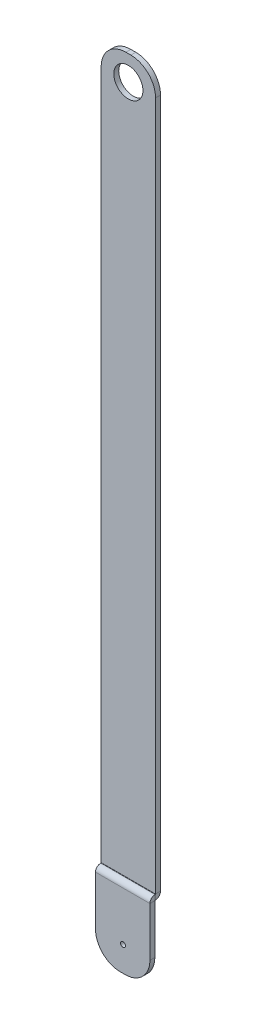
ISO-10303-21;
HEADER;
FILE_DESCRIPTION(('STEP AP214'),'2;1');
FILE_NAME('part.step','',(''),(''),'','','');
FILE_SCHEMA(('AUTOMOTIVE_DESIGN { 1 0 10303 214 1 1 1 1 }'));
ENDSEC;
DATA;
#1=APPLICATION_CONTEXT('core data for automotive mechanical design processes');
#2=APPLICATION_PROTOCOL_DEFINITION('international standard','automotive_design',2000,#1);
#3=PRODUCT_CONTEXT('',#1,'mechanical');
#4=PRODUCT('Part','Part','',(#3));
#5=PRODUCT_RELATED_PRODUCT_CATEGORY('part','',(#4));
#6=PRODUCT_DEFINITION_FORMATION('','',#4);
#7=PRODUCT_DEFINITION_CONTEXT('part definition',#1,'design');
#8=PRODUCT_DEFINITION('design','',#6,#7);
#9=PRODUCT_DEFINITION_SHAPE('','',#8);
#10=(LENGTH_UNIT() NAMED_UNIT(*) SI_UNIT(.MILLI.,.METRE.));
#11=(NAMED_UNIT(*) PLANE_ANGLE_UNIT() SI_UNIT($,.RADIAN.));
#12=(NAMED_UNIT(*) SI_UNIT($,.STERADIAN.) SOLID_ANGLE_UNIT());
#13=UNCERTAINTY_MEASURE_WITH_UNIT(LENGTH_MEASURE(1.E-05),#10,'distance_accuracy_value','');
#14=(GEOMETRIC_REPRESENTATION_CONTEXT(3) GLOBAL_UNCERTAINTY_ASSIGNED_CONTEXT((#13)) GLOBAL_UNIT_ASSIGNED_CONTEXT((#10,
#11,#12)) REPRESENTATION_CONTEXT('',''));
#15=CARTESIAN_POINT('',(0.,0.,0.));
#16=DIRECTION('',(0.,0.,1.));
#17=DIRECTION('',(1.,0.,0.));
#18=AXIS2_PLACEMENT_3D('',#15,#16,#17);
#19=CARTESIAN_POINT('',(-154.99999999991,-143.855000000007,-0.0450000000055647));
#20=DIRECTION('',(-1.,-6.24594126419353E-13,-5.06469866046188E-13));
#21=DIRECTION('',(6.24594126419353E-13,-1.,0.));
#22=AXIS2_PLACEMENT_3D('',#19,#20,#21);
#23=PLANE('',#22);
#24=DIRECTION('',(6.24594126419353E-13,-1.,0.));
#25=VECTOR('',#24,1.);
#26=CARTESIAN_POINT('',(-154.99999999991,-143.855000000007,-0.0450000000055647));
#27=LINE('',#26,#25);
#28=CARTESIAN_POINT('',(-154.99999999991,-143.855000000007,-0.0450000000055647));
#29=VERTEX_POINT('',#28);
#30=CARTESIAN_POINT('',(-154.999999999909,-145.855000000007,-0.0450000000055647));
#31=VERTEX_POINT('',#30);
#32=EDGE_CURVE('E278',#29,#31,#27,.T.);
#33=ORIENTED_EDGE('',*,*,#32,.F.);
#34=CARTESIAN_POINT('',(-154.99999999991,-143.755000000007,-0.0450000000055647));
#35=DIRECTION('',(1.,6.24594126419353E-13,5.06469866046188E-13));
#36=DIRECTION('',(-6.24594126419353E-13,1.,0.));
#37=AXIS2_PLACEMENT_3D('',#34,#35,#36);
#38=CIRCLE('',#37,0.1);
#39=CARTESIAN_POINT('',(-154.99999999991,-143.755000000007,-0.145000000005565));
#40=VERTEX_POINT('',#39);
#41=EDGE_CURVE('E195',#40,#29,#38,.F.);
#42=ORIENTED_EDGE('',*,*,#41,.F.);
#43=DIRECTION('',(-5.06469866046223E-13,0.,1.));
#44=VECTOR('',#43,1.);
#45=CARTESIAN_POINT('',(-154.999999999909,-143.755000000007,-2.14500000000556));
#46=LINE('',#45,#44);
#47=CARTESIAN_POINT('',(-154.999999999909,-143.755000000007,-2.14500000000556));
#48=VERTEX_POINT('',#47);
#49=EDGE_CURVE('E275',#48,#40,#46,.T.);
#50=ORIENTED_EDGE('',*,*,#49,.F.);
#51=CARTESIAN_POINT('',(-154.99999999991,-143.755000000007,-0.0450000000055647));
#52=DIRECTION('',(-1.,-6.24594126419353E-13,-5.06469866046188E-13));
#53=DIRECTION('',(6.24594126419353E-13,-1.,0.));
#54=AXIS2_PLACEMENT_3D('',#51,#52,#53);
#55=CIRCLE('',#54,2.1);
#56=EDGE_CURVE('E205',#48,#31,#55,.T.);
#57=ORIENTED_EDGE('',*,*,#56,.T.);
#58=EDGE_LOOP('',(#33,#42,#50,#57));
#59=FACE_BOUND('',#58,.T.);
#60=ADVANCED_FACE('F40',(#59),#23,.T.);
#61=CARTESIAN_POINT('',(-154.999999999909,-143.755000000007,-2.14500000000556));
#62=DIRECTION('',(-1.,-6.24594126419353E-13,-5.06469866046188E-13));
#63=DIRECTION('',(6.24594126419353E-13,-1.,0.));
#64=AXIS2_PLACEMENT_3D('',#61,#62,#63);
#65=PLANE('',#64);
#66=DIRECTION('',(-5.06469866046189E-13,0.,1.));
#67=VECTOR('',#66,1.);
#68=CARTESIAN_POINT('',(-154.99999999991,-143.855000000007,-0.145000000005565));
#69=LINE('',#68,#67);
#70=CARTESIAN_POINT('',(-154.99999999991,-143.855000000007,0.0449999999944219));
#71=VERTEX_POINT('',#70);
#72=EDGE_CURVE('E193',#29,#71,#69,.T.);
#73=ORIENTED_EDGE('',*,*,#72,.F.);
#74=ORIENTED_EDGE('',*,*,#32,.T.);
#75=DIRECTION('',(-5.06469866046189E-13,0.,1.));
#76=VECTOR('',#75,1.);
#77=CARTESIAN_POINT('',(-154.999999999909,-145.855000000007,-0.145000000005565));
#78=LINE('',#77,#76);
#79=CARTESIAN_POINT('',(-154.999999999909,-145.855000000007,0.0449999999944219));
#80=VERTEX_POINT('',#79);
#81=EDGE_CURVE('E208',#31,#80,#78,.T.);
#82=ORIENTED_EDGE('',*,*,#81,.T.);
#83=DIRECTION('',(-6.24594126419353E-13,1.,0.));
#84=VECTOR('',#83,1.);
#85=CARTESIAN_POINT('',(-154.999999999909,-145.855000000007,0.0449999999944219));
#86=LINE('',#85,#84);
#87=EDGE_CURVE('E167',#80,#71,#86,.T.);
#88=ORIENTED_EDGE('',*,*,#87,.T.);
#89=EDGE_LOOP('',(#73,#74,#82,#88));
#90=FACE_BOUND('',#89,.T.);
#91=ADVANCED_FACE('F344',(#90),#65,.T.);
#92=CARTESIAN_POINT('',(-132.99999999991,-143.754999999993,-0.144999999994422));
#93=DIRECTION('',(1.,6.24594126419353E-13,5.06469866046188E-13));
#94=DIRECTION('',(-6.24594126419353E-13,1.,0.));
#95=AXIS2_PLACEMENT_3D('',#92,#93,#94);
#96=PLANE('',#95);
#97=DIRECTION('',(5.06469866046223E-13,0.,-1.));
#98=VECTOR('',#97,1.);
#99=CARTESIAN_POINT('',(-132.99999999991,-143.754999999993,-0.144999999994422));
#100=LINE('',#99,#98);
#101=CARTESIAN_POINT('',(-132.99999999991,-143.754999999993,-0.144999999994422));
#102=VERTEX_POINT('',#101);
#103=CARTESIAN_POINT('',(-132.999999999909,-143.754999999994,-2.14499999999442));
#104=VERTEX_POINT('',#103);
#105=EDGE_CURVE('E272',#102,#104,#100,.T.);
#106=ORIENTED_EDGE('',*,*,#105,.F.);
#107=CARTESIAN_POINT('',(-132.99999999991,-143.754999999993,-0.0449999999944223));
#108=DIRECTION('',(1.,6.24594126419353E-13,5.06469866046188E-13));
#109=DIRECTION('',(-6.24594126419353E-13,1.,0.));
#110=AXIS2_PLACEMENT_3D('',#107,#108,#109);
#111=CIRCLE('',#110,0.1);
#112=CARTESIAN_POINT('',(-132.99999999991,-143.854999999993,-0.0449999999944223));
#113=VERTEX_POINT('',#112);
#114=EDGE_CURVE('E223',#102,#113,#111,.F.);
#115=ORIENTED_EDGE('',*,*,#114,.T.);
#116=DIRECTION('',(-6.24594126419353E-13,1.,0.));
#117=VECTOR('',#116,1.);
#118=CARTESIAN_POINT('',(-132.999999999909,-145.854999999993,-0.0449999999944223));
#119=LINE('',#118,#117);
#120=CARTESIAN_POINT('',(-132.999999999909,-145.854999999993,-0.0449999999944223));
#121=VERTEX_POINT('',#120);
#122=EDGE_CURVE('E166',#121,#113,#119,.T.);
#123=ORIENTED_EDGE('',*,*,#122,.F.);
#124=CARTESIAN_POINT('',(-132.99999999991,-143.754999999993,-0.0449999999944223));
#125=DIRECTION('',(-1.,-6.24594126419353E-13,-5.06469866046188E-13));
#126=DIRECTION('',(6.24594126419353E-13,-1.,0.));
#127=AXIS2_PLACEMENT_3D('',#124,#125,#126);
#128=CIRCLE('',#127,2.1);
#129=EDGE_CURVE('E230',#104,#121,#128,.T.);
#130=ORIENTED_EDGE('',*,*,#129,.F.);
#131=EDGE_LOOP('',(#106,#115,#123,#130));
#132=FACE_BOUND('',#131,.T.);
#133=ADVANCED_FACE('F388',(#132),#96,.T.);
#134=CARTESIAN_POINT('',(-132.999999999909,-145.854999999993,-0.0449999999944223));
#135=DIRECTION('',(1.,6.24594126419353E-13,5.06469866046188E-13));
#136=DIRECTION('',(-6.24594126419353E-13,1.,0.));
#137=AXIS2_PLACEMENT_3D('',#134,#135,#136);
#138=PLANE('',#137);
#139=DIRECTION('',(6.24594126419353E-13,-1.,0.));
#140=VECTOR('',#139,1.);
#141=CARTESIAN_POINT('',(-133.000000000089,145.145000000007,-2.14499999999442));
#142=LINE('',#141,#140);
#143=CARTESIAN_POINT('',(-133.000000000083,135.145000000007,-2.14499999999442));
#144=VERTEX_POINT('',#143);
#145=EDGE_CURVE('E228',#144,#104,#142,.T.);
#146=ORIENTED_EDGE('',*,*,#145,.F.);
#147=DIRECTION('',(-5.06469866046189E-13,0.,1.));
#148=VECTOR('',#147,1.);
#149=CARTESIAN_POINT('',(-133.000000000084,135.145000000007,-0.0449999999944223));
#150=LINE('',#149,#148);
#151=CARTESIAN_POINT('',(-133.000000000084,135.145000000007,-0.144999999994422));
#152=VERTEX_POINT('',#151);
#153=EDGE_CURVE('E297',#144,#152,#150,.T.);
#154=ORIENTED_EDGE('',*,*,#153,.T.);
#155=DIRECTION('',(6.24594126419353E-13,-1.,0.));
#156=VECTOR('',#155,1.);
#157=CARTESIAN_POINT('',(-133.00000000009,145.145000000007,-0.144999999994422));
#158=LINE('',#157,#156);
#159=EDGE_CURVE('E226',#152,#102,#158,.T.);
#160=ORIENTED_EDGE('',*,*,#159,.T.);
#161=ORIENTED_EDGE('',*,*,#105,.T.);
#162=EDGE_LOOP('',(#146,#154,#160,#161));
#163=FACE_BOUND('',#162,.T.);
#164=ADVANCED_FACE('F317',(#163),#138,.T.);
#165=CARTESIAN_POINT('',(-154.99999999991,-145.955000000007,2.14499999999442));
#166=DIRECTION('',(-1.,-6.24594126419353E-13,-5.06469866046188E-13));
#167=DIRECTION('',(6.24594126419353E-13,-1.,0.));
#168=AXIS2_PLACEMENT_3D('',#165,#166,#167);
#169=PLANE('',#168);
#170=DIRECTION('',(5.06469866046189E-13,0.,-1.));
#171=VECTOR('',#170,1.);
#172=CARTESIAN_POINT('',(-154.99999999991,-145.955000000007,2.14499999999442));
#173=LINE('',#172,#171);
#174=CARTESIAN_POINT('',(-154.99999999991,-145.955000000007,2.14499999999442));
#175=VERTEX_POINT('',#174);
#176=CARTESIAN_POINT('',(-154.999999999909,-145.955000000007,0.144999999994422));
#177=VERTEX_POINT('',#176);
#178=EDGE_CURVE('E154',#175,#177,#173,.T.);
#179=ORIENTED_EDGE('',*,*,#178,.F.);
#180=CARTESIAN_POINT('',(-154.999999999909,-145.955000000007,0.0449999999944219));
#181=DIRECTION('',(-1.,-6.24594126419353E-13,-5.06469866046188E-13));
#182=DIRECTION('',(6.24594126419353E-13,-1.,0.));
#183=AXIS2_PLACEMENT_3D('',#180,#181,#182);
#184=CIRCLE('',#183,2.1);
#185=EDGE_CURVE('E158',#71,#175,#184,.F.);
#186=ORIENTED_EDGE('',*,*,#185,.F.);
#187=ORIENTED_EDGE('',*,*,#87,.F.);
#188=CARTESIAN_POINT('',(-154.999999999909,-145.955000000007,0.0449999999944219));
#189=DIRECTION('',(-1.,-6.24594126419353E-13,-5.06469866046188E-13));
#190=DIRECTION('',(6.24594126419353E-13,-1.,0.));
#191=AXIS2_PLACEMENT_3D('',#188,#189,#190);
#192=CIRCLE('',#191,0.0999999999999998);
#193=EDGE_CURVE('E161',#80,#177,#192,.F.);
#194=ORIENTED_EDGE('',*,*,#193,.T.);
#195=EDGE_LOOP('',(#179,#186,#187,#194));
#196=FACE_BOUND('',#195,.T.);
#197=ADVANCED_FACE('F156',(#196),#169,.T.);
#198=CARTESIAN_POINT('',(-154.999999999909,-145.855000000007,0.0449999999944219));
#199=DIRECTION('',(-1.,-6.24594126419353E-13,-5.06469866046188E-13));
#200=DIRECTION('',(6.24594126419353E-13,-1.,0.));
#201=AXIS2_PLACEMENT_3D('',#198,#199,#200);
#202=PLANE('',#201);
#203=DIRECTION('',(6.24594126419353E-13,-1.,0.));
#204=VECTOR('',#203,1.);
#205=CARTESIAN_POINT('',(-154.99999999991,-143.855000000007,0.144999999994422));
#206=LINE('',#205,#204);
#207=CARTESIAN_POINT('',(-154.999999999896,-165.855000000007,0.144999999994422));
#208=VERTEX_POINT('',#207);
#209=EDGE_CURVE('E188',#177,#208,#206,.T.);
#210=ORIENTED_EDGE('',*,*,#209,.T.);
#211=DIRECTION('',(5.06469866046189E-13,0.,-1.));
#212=VECTOR('',#211,1.);
#213=CARTESIAN_POINT('',(-154.999999999896,-165.855000000007,0.0449999999944219));
#214=LINE('',#213,#212);
#215=CARTESIAN_POINT('',(-154.999999999897,-165.855000000007,2.14499999999442));
#216=VERTEX_POINT('',#215);
#217=EDGE_CURVE('E187',#208,#216,#214,.F.);
#218=ORIENTED_EDGE('',*,*,#217,.T.);
#219=DIRECTION('',(6.24594126419353E-13,-1.,0.));
#220=VECTOR('',#219,1.);
#221=CARTESIAN_POINT('',(-154.999999999911,-143.855000000007,2.14499999999442));
#222=LINE('',#221,#220);
#223=EDGE_CURVE('E175',#175,#216,#222,.T.);
#224=ORIENTED_EDGE('',*,*,#223,.F.);
#225=ORIENTED_EDGE('',*,*,#178,.T.);
#226=EDGE_LOOP('',(#210,#218,#224,#225));
#227=FACE_BOUND('',#226,.T.);
#228=ADVANCED_FACE('F185',(#227),#202,.T.);
#229=CARTESIAN_POINT('',(-132.99999999991,-143.854999999993,0.0450000000055643));
#230=DIRECTION('',(1.,6.24594126419353E-13,5.06469866046188E-13));
#231=DIRECTION('',(-6.24594126419353E-13,1.,0.));
#232=AXIS2_PLACEMENT_3D('',#229,#230,#231);
#233=PLANE('',#232);
#234=DIRECTION('',(6.24594126419353E-13,-1.,0.));
#235=VECTOR('',#234,1.);
#236=CARTESIAN_POINT('',(-132.99999999991,-143.854999999993,0.0450000000055643));
#237=LINE('',#236,#235);
#238=CARTESIAN_POINT('',(-132.99999999991,-143.854999999993,0.0450000000055643));
#239=VERTEX_POINT('',#238);
#240=CARTESIAN_POINT('',(-132.999999999909,-145.854999999993,0.0450000000055643));
#241=VERTEX_POINT('',#240);
#242=EDGE_CURVE('E268',#239,#241,#237,.T.);
#243=ORIENTED_EDGE('',*,*,#242,.F.);
#244=CARTESIAN_POINT('',(-132.999999999909,-145.954999999993,0.0450000000055643));
#245=DIRECTION('',(-1.,-6.24594126419353E-13,-5.06469866046188E-13));
#246=DIRECTION('',(6.24594126419353E-13,-1.,0.));
#247=AXIS2_PLACEMENT_3D('',#244,#245,#246);
#248=CIRCLE('',#247,2.1);
#249=CARTESIAN_POINT('',(-132.99999999991,-145.954999999993,2.14500000000556));
#250=VERTEX_POINT('',#249);
#251=EDGE_CURVE('E218',#239,#250,#248,.F.);
#252=ORIENTED_EDGE('',*,*,#251,.T.);
#253=DIRECTION('',(-5.06469866046189E-13,0.,1.));
#254=VECTOR('',#253,1.);
#255=CARTESIAN_POINT('',(-132.999999999909,-145.954999999993,0.145000000005564));
#256=LINE('',#255,#254);
#257=CARTESIAN_POINT('',(-132.999999999909,-145.954999999993,0.145000000005564));
#258=VERTEX_POINT('',#257);
#259=EDGE_CURVE('E266',#258,#250,#256,.T.);
#260=ORIENTED_EDGE('',*,*,#259,.F.);
#261=CARTESIAN_POINT('',(-132.999999999909,-145.954999999993,0.0450000000055643));
#262=DIRECTION('',(-1.,-6.24594126419353E-13,-5.06469866046188E-13));
#263=DIRECTION('',(6.24594126419353E-13,-1.,0.));
#264=AXIS2_PLACEMENT_3D('',#261,#262,#263);
#265=CIRCLE('',#264,0.0999999999999998);
#266=EDGE_CURVE('E236',#241,#258,#265,.F.);
#267=ORIENTED_EDGE('',*,*,#266,.F.);
#268=EDGE_LOOP('',(#243,#252,#260,#267));
#269=FACE_BOUND('',#268,.T.);
#270=ADVANCED_FACE('F573',(#269),#233,.T.);
#271=CARTESIAN_POINT('',(-132.999999999909,-145.954999999993,0.145000000005564));
#272=DIRECTION('',(1.,6.24594126419353E-13,5.06469866046188E-13));
#273=DIRECTION('',(-6.24594126419353E-13,1.,0.));
#274=AXIS2_PLACEMENT_3D('',#271,#272,#273);
#275=PLANE('',#274);
#276=DIRECTION('',(-5.06469866046189E-13,0.,1.));
#277=VECTOR('',#276,1.);
#278=CARTESIAN_POINT('',(-132.99999999991,-143.854999999993,-0.144999999994422));
#279=LINE('',#278,#277);
#280=EDGE_CURVE('E220',#113,#239,#279,.T.);
#281=ORIENTED_EDGE('',*,*,#280,.T.);
#282=ORIENTED_EDGE('',*,*,#242,.T.);
#283=DIRECTION('',(-5.06469866046189E-13,0.,1.));
#284=VECTOR('',#283,1.);
#285=CARTESIAN_POINT('',(-132.999999999909,-145.854999999993,-0.144999999994422));
#286=LINE('',#285,#284);
#287=EDGE_CURVE('E233',#121,#241,#286,.T.);
#288=ORIENTED_EDGE('',*,*,#287,.F.);
#289=ORIENTED_EDGE('',*,*,#122,.T.);
#290=EDGE_LOOP('',(#281,#282,#288,#289));
#291=FACE_BOUND('',#290,.T.);
#292=ADVANCED_FACE('F447',(#291),#275,.T.);
#293=CARTESIAN_POINT('',(-154.99999999991,-143.855000000007,0.144999999994422));
#294=DIRECTION('',(-5.06469866046189E-13,0.,1.));
#295=DIRECTION('',(-1.,-6.24594126419353E-13,-5.06469866046188E-13));
#296=AXIS2_PLACEMENT_3D('',#293,#294,#295);
#297=PLANE('',#296);
#298=CARTESIAN_POINT('',(-143.883433504186,-165.73802674259,0.145000000000052));
#299=DIRECTION('',(-5.06469866046189E-13,0.,1.));
#300=DIRECTION('',(-1.,-6.24594126419353E-13,-5.06469866046188E-13));
#301=AXIS2_PLACEMENT_3D('',#298,#299,#300);
#302=CIRCLE('',#301,1.);
#303=CARTESIAN_POINT('',(-144.883433504186,-165.73802674259,0.144999999999545));
#304=VERTEX_POINT('',#303);
#305=EDGE_CURVE('E216',#304,#304,#302,.T.);
#306=ORIENTED_EDGE('',*,*,#305,.T.);
#307=EDGE_LOOP('',(#306));
#308=FACE_BOUND('',#307,.T.);
#309=DIRECTION('',(1.,6.24594126419353E-13,5.06469866046188E-13));
#310=VECTOR('',#309,1.);
#311=CARTESIAN_POINT('',(-154.99999999989,-175.855000000007,0.144999999994422));
#312=LINE('',#311,#310);
#313=CARTESIAN_POINT('',(-144.99999999989,-175.855000000001,0.144999999999486));
#314=VERTEX_POINT('',#313);
#315=CARTESIAN_POINT('',(-142.99999999989,-175.855,0.145000000000499));
#316=VERTEX_POINT('',#315);
#317=EDGE_CURVE('E263',#314,#316,#312,.T.);
#318=ORIENTED_EDGE('',*,*,#317,.F.);
#319=CARTESIAN_POINT('',(-144.999999999896,-165.855000000001,0.144999999999486));
#320=DIRECTION('',(-5.06469866046189E-13,0.,1.));
#321=DIRECTION('',(-1.,-6.24594126419353E-13,-5.06469866046188E-13));
#322=AXIS2_PLACEMENT_3D('',#319,#320,#321);
#323=CIRCLE('',#322,10.);
#324=EDGE_CURVE('E287',#314,#208,#323,.F.);
#325=ORIENTED_EDGE('',*,*,#324,.T.);
#326=ORIENTED_EDGE('',*,*,#209,.F.);
#327=DIRECTION('',(1.,6.24594126419353E-13,5.06469866046188E-13));
#328=VECTOR('',#327,1.);
#329=CARTESIAN_POINT('',(-154.999999999909,-145.955000000007,0.144999999994422));
#330=LINE('',#329,#328);
#331=EDGE_CURVE('E212',#177,#258,#330,.T.);
#332=ORIENTED_EDGE('',*,*,#331,.T.);
#333=DIRECTION('',(6.24594126419353E-13,-1.,0.));
#334=VECTOR('',#333,1.);
#335=CARTESIAN_POINT('',(-132.99999999991,-143.854999999993,0.145000000005564));
#336=LINE('',#335,#334);
#337=CARTESIAN_POINT('',(-132.999999999896,-165.854999999993,0.145000000005564));
#338=VERTEX_POINT('',#337);
#339=EDGE_CURVE('E213',#258,#338,#336,.T.);
#340=ORIENTED_EDGE('',*,*,#339,.T.);
#341=CARTESIAN_POINT('',(-142.999999999896,-165.855,0.145000000000499));
#342=DIRECTION('',(-5.06469866046189E-13,0.,1.));
#343=DIRECTION('',(-1.,-6.24594126419353E-13,-5.06469866046188E-13));
#344=AXIS2_PLACEMENT_3D('',#341,#342,#343);
#345=CIRCLE('',#344,10.);
#346=EDGE_CURVE('E285',#338,#316,#345,.F.);
#347=ORIENTED_EDGE('',*,*,#346,.T.);
#348=EDGE_LOOP('',(#318,#325,#326,#332,#340,#347));
#349=FACE_BOUND('',#348,.T.);
#350=ADVANCED_FACE('F357',(#308,#349),#297,.F.);
#351=CARTESIAN_POINT('',(-154.999999999891,-175.855000000007,2.14499999999442));
#352=DIRECTION('',(6.24594126419353E-13,-1.,0.));
#353=DIRECTION('',(1.,6.24594126419353E-13,5.06469866046188E-13));
#354=AXIS2_PLACEMENT_3D('',#351,#352,#353);
#355=PLANE('',#354);
#356=DIRECTION('',(1.,6.24594126419353E-13,5.06469866046188E-13));
#357=VECTOR('',#356,1.);
#358=CARTESIAN_POINT('',(-154.999999999891,-175.855000000007,2.14499999999442));
#359=LINE('',#358,#357);
#360=CARTESIAN_POINT('',(-144.999999999891,-175.855000000001,2.14499999999949));
#361=VERTEX_POINT('',#360);
#362=CARTESIAN_POINT('',(-142.999999999891,-175.855,2.1450000000005));
#363=VERTEX_POINT('',#362);
#364=EDGE_CURVE('E182',#361,#363,#359,.T.);
#365=ORIENTED_EDGE('',*,*,#364,.F.);
#366=DIRECTION('',(5.06469866046189E-13,0.,-1.));
#367=VECTOR('',#366,1.);
#368=CARTESIAN_POINT('',(-144.999999999891,-175.855000000001,2.14499999999949));
#369=LINE('',#368,#367);
#370=EDGE_CURVE('E282',#361,#314,#369,.T.);
#371=ORIENTED_EDGE('',*,*,#370,.T.);
#372=ORIENTED_EDGE('',*,*,#317,.T.);
#373=DIRECTION('',(5.06469866046189E-13,0.,-1.));
#374=VECTOR('',#373,1.);
#375=CARTESIAN_POINT('',(-142.999999999891,-175.855,2.1450000000005));
#376=LINE('',#375,#374);
#377=EDGE_CURVE('E280',#316,#363,#376,.F.);
#378=ORIENTED_EDGE('',*,*,#377,.T.);
#379=EDGE_LOOP('',(#365,#371,#372,#378));
#380=FACE_BOUND('',#379,.T.);
#381=ADVANCED_FACE('F446',(#380),#355,.T.);
#382=CARTESIAN_POINT('',(-154.999999999911,-143.855000000007,2.14499999999442));
#383=DIRECTION('',(-5.06469866046189E-13,0.,1.));
#384=DIRECTION('',(-1.,-6.24594126419353E-13,-5.06469866046188E-13));
#385=AXIS2_PLACEMENT_3D('',#382,#383,#384);
#386=PLANE('',#385);
#387=CARTESIAN_POINT('',(-143.883433504187,-165.73802674259,2.14500000000005));
#388=DIRECTION('',(-5.06469866046189E-13,0.,1.));
#389=DIRECTION('',(-1.,-6.24594126419353E-13,-5.06469866046188E-13));
#390=AXIS2_PLACEMENT_3D('',#387,#388,#389);
#391=CIRCLE('',#390,1.);
#392=CARTESIAN_POINT('',(-144.883433504187,-165.73802674259,2.14499999999955));
#393=VERTEX_POINT('',#392);
#394=EDGE_CURVE('E365',#393,#393,#391,.T.);
#395=ORIENTED_EDGE('',*,*,#394,.F.);
#396=EDGE_LOOP('',(#395));
#397=FACE_BOUND('',#396,.T.);
#398=ORIENTED_EDGE('',*,*,#223,.T.);
#399=CARTESIAN_POINT('',(-144.999999999897,-165.855000000001,2.14499999999949));
#400=DIRECTION('',(-5.06469866046189E-13,0.,1.));
#401=DIRECTION('',(-1.,-6.24594126419353E-13,-5.06469866046188E-13));
#402=AXIS2_PLACEMENT_3D('',#399,#400,#401);
#403=CIRCLE('',#402,10.);
#404=EDGE_CURVE('E292',#216,#361,#403,.T.);
#405=ORIENTED_EDGE('',*,*,#404,.T.);
#406=ORIENTED_EDGE('',*,*,#364,.T.);
#407=CARTESIAN_POINT('',(-142.999999999897,-165.855,2.1450000000005));
#408=DIRECTION('',(-5.06469866046189E-13,0.,1.));
#409=DIRECTION('',(-1.,-6.24594126419353E-13,-5.06469866046188E-13));
#410=AXIS2_PLACEMENT_3D('',#407,#408,#409);
#411=CIRCLE('',#410,10.);
#412=CARTESIAN_POINT('',(-132.999999999897,-165.854999999993,2.14500000000556));
#413=VERTEX_POINT('',#412);
#414=EDGE_CURVE('E290',#363,#413,#411,.T.);
#415=ORIENTED_EDGE('',*,*,#414,.T.);
#416=DIRECTION('',(6.24594126419353E-13,-1.,0.));
#417=VECTOR('',#416,1.);
#418=CARTESIAN_POINT('',(-132.999999999911,-143.854999999993,2.14500000000556));
#419=LINE('',#418,#417);
#420=EDGE_CURVE('E178',#250,#413,#419,.T.);
#421=ORIENTED_EDGE('',*,*,#420,.F.);
#422=DIRECTION('',(1.,6.24594126419353E-13,5.06469866046188E-13));
#423=VECTOR('',#422,1.);
#424=CARTESIAN_POINT('',(-154.99999999991,-145.955000000007,2.14499999999442));
#425=LINE('',#424,#423);
#426=EDGE_CURVE('E173',#175,#250,#425,.T.);
#427=ORIENTED_EDGE('',*,*,#426,.F.);
#428=EDGE_LOOP('',(#398,#405,#406,#415,#421,#427));
#429=FACE_BOUND('',#428,.T.);
#430=ADVANCED_FACE('F174',(#397,#429),#386,.T.);
#431=CARTESIAN_POINT('',(-154.999999999909,-145.955000000007,0.0449999999944219));
#432=DIRECTION('',(1.,6.24594126419353E-13,5.06469866046188E-13));
#433=DIRECTION('',(-6.24594126419353E-13,1.,0.));
#434=AXIS2_PLACEMENT_3D('',#431,#432,#433);
#435=CYLINDRICAL_SURFACE('',#434,2.1);
#436=ORIENTED_EDGE('',*,*,#251,.F.);
#437=DIRECTION('',(1.,6.24594126419353E-13,5.06469866046188E-13));
#438=VECTOR('',#437,1.);
#439=CARTESIAN_POINT('',(-154.99999999991,-143.855000000007,0.0449999999944219));
#440=LINE('',#439,#438);
#441=EDGE_CURVE('E183',#71,#239,#440,.T.);
#442=ORIENTED_EDGE('',*,*,#441,.F.);
#443=ORIENTED_EDGE('',*,*,#185,.T.);
#444=ORIENTED_EDGE('',*,*,#426,.T.);
#445=EDGE_LOOP('',(#436,#442,#443,#444));
#446=FACE_BOUND('',#445,.T.);
#447=ADVANCED_FACE('F191',(#446),#435,.T.);
#448=CARTESIAN_POINT('',(-154.99999999991,-143.855000000007,-0.145000000005565));
#449=DIRECTION('',(-6.24594126419353E-13,1.,0.));
#450=DIRECTION('',(-1.,-6.24594126419353E-13,-5.06469866046188E-13));
#451=AXIS2_PLACEMENT_3D('',#448,#449,#450);
#452=PLANE('',#451);
#453=ORIENTED_EDGE('',*,*,#280,.F.);
#454=DIRECTION('',(1.,6.24594126419353E-13,5.06469866046188E-13));
#455=VECTOR('',#454,1.);
#456=CARTESIAN_POINT('',(-154.99999999991,-143.855000000007,-0.0450000000055647));
#457=LINE('',#456,#455);
#458=EDGE_CURVE('E257',#29,#113,#457,.T.);
#459=ORIENTED_EDGE('',*,*,#458,.F.);
#460=ORIENTED_EDGE('',*,*,#72,.T.);
#461=ORIENTED_EDGE('',*,*,#441,.T.);
#462=EDGE_LOOP('',(#453,#459,#460,#461));
#463=FACE_BOUND('',#462,.T.);
#464=ADVANCED_FACE('F343',(#463),#452,.T.);
#465=CARTESIAN_POINT('',(-154.99999999991,-143.755000000007,-0.0450000000055647));
#466=DIRECTION('',(1.,6.24594126419353E-13,5.06469866046188E-13));
#467=DIRECTION('',(-6.24594126419353E-13,1.,0.));
#468=AXIS2_PLACEMENT_3D('',#465,#466,#467);
#469=CYLINDRICAL_SURFACE('',#468,0.1);
#470=ORIENTED_EDGE('',*,*,#114,.F.);
#471=DIRECTION('',(1.,6.24594126419353E-13,5.06469866046188E-13));
#472=VECTOR('',#471,1.);
#473=CARTESIAN_POINT('',(-154.99999999991,-143.755000000007,-0.145000000005565));
#474=LINE('',#473,#472);
#475=EDGE_CURVE('E254',#40,#102,#474,.T.);
#476=ORIENTED_EDGE('',*,*,#475,.F.);
#477=ORIENTED_EDGE('',*,*,#41,.T.);
#478=ORIENTED_EDGE('',*,*,#458,.T.);
#479=EDGE_LOOP('',(#470,#476,#477,#478));
#480=FACE_BOUND('',#479,.T.);
#481=ADVANCED_FACE('F335',(#480),#469,.F.);
#482=CARTESIAN_POINT('',(-155.00000000009,145.144999999993,-0.145000000005565));
#483=DIRECTION('',(-5.06469866046189E-13,0.,1.));
#484=DIRECTION('',(-1.,-6.24594126419353E-13,-5.06469866046188E-13));
#485=AXIS2_PLACEMENT_3D('',#482,#483,#484);
#486=PLANE('',#485);
#487=CARTESIAN_POINT('',(-144.000000000084,135.145,-0.144999999999994));
#488=DIRECTION('',(-5.06469866046189E-13,0.,1.));
#489=DIRECTION('',(-1.,-6.24594126419353E-13,-5.06469866046188E-13));
#490=AXIS2_PLACEMENT_3D('',#487,#488,#489);
#491=CIRCLE('',#490,5.89418421464922);
#492=CARTESIAN_POINT('',(-149.894184214733,135.144999999996,-0.145000000002979));
#493=VERTEX_POINT('',#492);
#494=EDGE_CURVE('E361',#493,#493,#491,.T.);
#495=ORIENTED_EDGE('',*,*,#494,.F.);
#496=EDGE_LOOP('',(#495));
#497=FACE_BOUND('',#496,.T.);
#498=ORIENTED_EDGE('',*,*,#159,.F.);
#499=CARTESIAN_POINT('',(-143.000000000084,135.145,-0.144999999999487));
#500=DIRECTION('',(-5.06469866046189E-13,0.,1.));
#501=DIRECTION('',(-1.,-6.24594126419353E-13,-5.06469866046188E-13));
#502=AXIS2_PLACEMENT_3D('',#499,#500,#501);
#503=CIRCLE('',#502,10.);
#504=CARTESIAN_POINT('',(-143.00000000009,145.145,-0.144999999999487));
#505=VERTEX_POINT('',#504);
#506=EDGE_CURVE('E302',#152,#505,#503,.T.);
#507=ORIENTED_EDGE('',*,*,#506,.T.);
#508=DIRECTION('',(1.,6.24594126419353E-13,5.06469866046188E-13));
#509=VECTOR('',#508,1.);
#510=CARTESIAN_POINT('',(-155.00000000009,145.144999999993,-0.145000000005565));
#511=LINE('',#510,#509);
#512=CARTESIAN_POINT('',(-145.00000000009,145.144999999999,-0.1450000000005));
#513=VERTEX_POINT('',#512);
#514=EDGE_CURVE('E252',#513,#505,#511,.T.);
#515=ORIENTED_EDGE('',*,*,#514,.F.);
#516=CARTESIAN_POINT('',(-145.000000000084,135.144999999999,-0.1450000000005));
#517=DIRECTION('',(-5.06469866046189E-13,0.,1.));
#518=DIRECTION('',(-1.,-6.24594126419353E-13,-5.06469866046188E-13));
#519=AXIS2_PLACEMENT_3D('',#516,#517,#518);
#520=CIRCLE('',#519,10.);
#521=CARTESIAN_POINT('',(-155.000000000084,135.144999999993,-0.145000000005565));
#522=VERTEX_POINT('',#521);
#523=EDGE_CURVE('E300',#513,#522,#520,.T.);
#524=ORIENTED_EDGE('',*,*,#523,.T.);
#525=DIRECTION('',(6.24594126419353E-13,-1.,0.));
#526=VECTOR('',#525,1.);
#527=CARTESIAN_POINT('',(-155.00000000009,145.144999999993,-0.145000000005565));
#528=LINE('',#527,#526);
#529=EDGE_CURVE('E201',#522,#40,#528,.T.);
#530=ORIENTED_EDGE('',*,*,#529,.T.);
#531=ORIENTED_EDGE('',*,*,#475,.T.);
#532=EDGE_LOOP('',(#498,#507,#515,#524,#530,#531));
#533=FACE_BOUND('',#532,.T.);
#534=ADVANCED_FACE('F323',(#497,#533),#486,.T.);
#535=CARTESIAN_POINT('',(-155.000000000089,145.144999999993,-2.14500000000556));
#536=DIRECTION('',(-6.24594126419353E-13,1.,0.));
#537=DIRECTION('',(-1.,-6.24594126419353E-13,-5.06469866046188E-13));
#538=AXIS2_PLACEMENT_3D('',#535,#536,#537);
#539=PLANE('',#538);
#540=ORIENTED_EDGE('',*,*,#514,.T.);
#541=DIRECTION('',(-5.06469866046189E-13,0.,1.));
#542=VECTOR('',#541,1.);
#543=CARTESIAN_POINT('',(-143.000000000089,145.145,-2.14499999999949));
#544=LINE('',#543,#542);
#545=CARTESIAN_POINT('',(-143.000000000089,145.145,-2.14499999999949));
#546=VERTEX_POINT('',#545);
#547=EDGE_CURVE('E61',#505,#546,#544,.F.);
#548=ORIENTED_EDGE('',*,*,#547,.T.);
#549=DIRECTION('',(1.,6.24594126419353E-13,5.06469866046188E-13));
#550=VECTOR('',#549,1.);
#551=CARTESIAN_POINT('',(-155.000000000089,145.144999999993,-2.14500000000556));
#552=LINE('',#551,#550);
#553=CARTESIAN_POINT('',(-145.000000000089,145.144999999999,-2.1450000000005));
#554=VERTEX_POINT('',#553);
#555=EDGE_CURVE('E250',#554,#546,#552,.T.);
#556=ORIENTED_EDGE('',*,*,#555,.F.);
#557=DIRECTION('',(-5.06469866046189E-13,0.,1.));
#558=VECTOR('',#557,1.);
#559=CARTESIAN_POINT('',(-145.000000000089,145.144999999999,-2.1450000000005));
#560=LINE('',#559,#558);
#561=EDGE_CURVE('E304',#554,#513,#560,.T.);
#562=ORIENTED_EDGE('',*,*,#561,.T.);
#563=EDGE_LOOP('',(#540,#548,#556,#562));
#564=FACE_BOUND('',#563,.T.);
#565=ADVANCED_FACE('F324',(#564),#539,.T.);
#566=CARTESIAN_POINT('',(-155.000000000089,145.144999999993,-2.14500000000556));
#567=DIRECTION('',(-5.06469866046189E-13,0.,1.));
#568=DIRECTION('',(-1.,-6.24594126419353E-13,-5.06469866046188E-13));
#569=AXIS2_PLACEMENT_3D('',#566,#567,#568);
#570=PLANE('',#569);
#571=CARTESIAN_POINT('',(-144.000000000083,135.145,-2.14499999999999));
#572=DIRECTION('',(-5.06469866046189E-13,0.,1.));
#573=DIRECTION('',(-1.,-6.24594126419353E-13,-5.06469866046188E-13));
#574=AXIS2_PLACEMENT_3D('',#571,#572,#573);
#575=CIRCLE('',#574,5.89418421464922);
#576=CARTESIAN_POINT('',(-149.894184214732,135.144999999996,-2.14500000000298));
#577=VERTEX_POINT('',#576);
#578=EDGE_CURVE('E364',#577,#577,#575,.T.);
#579=ORIENTED_EDGE('',*,*,#578,.T.);
#580=EDGE_LOOP('',(#579));
#581=FACE_BOUND('',#580,.T.);
#582=ORIENTED_EDGE('',*,*,#555,.T.);
#583=CARTESIAN_POINT('',(-143.000000000083,135.145,-2.14499999999949));
#584=DIRECTION('',(-5.06469866046189E-13,0.,1.));
#585=DIRECTION('',(-1.,-6.24594126419353E-13,-5.06469866046188E-13));
#586=AXIS2_PLACEMENT_3D('',#583,#584,#585);
#587=CIRCLE('',#586,10.);
#588=EDGE_CURVE('E48',#546,#144,#587,.F.);
#589=ORIENTED_EDGE('',*,*,#588,.T.);
#590=ORIENTED_EDGE('',*,*,#145,.T.);
#591=DIRECTION('',(1.,6.24594126419353E-13,5.06469866046188E-13));
#592=VECTOR('',#591,1.);
#593=CARTESIAN_POINT('',(-154.999999999909,-143.755000000007,-2.14500000000556));
#594=LINE('',#593,#592);
#595=EDGE_CURVE('E247',#48,#104,#594,.T.);
#596=ORIENTED_EDGE('',*,*,#595,.F.);
#597=DIRECTION('',(6.24594126419353E-13,-1.,0.));
#598=VECTOR('',#597,1.);
#599=CARTESIAN_POINT('',(-155.000000000089,145.144999999993,-2.14500000000556));
#600=LINE('',#599,#598);
#601=CARTESIAN_POINT('',(-155.000000000083,135.144999999993,-2.14500000000556));
#602=VERTEX_POINT('',#601);
#603=EDGE_CURVE('E203',#602,#48,#600,.T.);
#604=ORIENTED_EDGE('',*,*,#603,.F.);
#605=CARTESIAN_POINT('',(-145.000000000083,135.144999999999,-2.1450000000005));
#606=DIRECTION('',(-5.06469866046189E-13,0.,1.));
#607=DIRECTION('',(-1.,-6.24594126419353E-13,-5.06469866046188E-13));
#608=AXIS2_PLACEMENT_3D('',#605,#606,#607);
#609=CIRCLE('',#608,10.);
#610=EDGE_CURVE('E308',#602,#554,#609,.F.);
#611=ORIENTED_EDGE('',*,*,#610,.T.);
#612=EDGE_LOOP('',(#582,#589,#590,#596,#604,#611));
#613=FACE_BOUND('',#612,.T.);
#614=ADVANCED_FACE('F312',(#581,#613),#570,.F.);
#615=CARTESIAN_POINT('',(-154.99999999991,-143.755000000007,-0.0450000000055647));
#616=DIRECTION('',(1.,6.24594126419353E-13,5.06469866046188E-13));
#617=DIRECTION('',(-6.24594126419353E-13,1.,0.));
#618=AXIS2_PLACEMENT_3D('',#615,#616,#617);
#619=CYLINDRICAL_SURFACE('',#618,2.1);
#620=ORIENTED_EDGE('',*,*,#129,.T.);
#621=DIRECTION('',(1.,6.24594126419353E-13,5.06469866046188E-13));
#622=VECTOR('',#621,1.);
#623=CARTESIAN_POINT('',(-154.999999999909,-145.855000000007,-0.0450000000055647));
#624=LINE('',#623,#622);
#625=EDGE_CURVE('E244',#31,#121,#624,.T.);
#626=ORIENTED_EDGE('',*,*,#625,.F.);
#627=ORIENTED_EDGE('',*,*,#56,.F.);
#628=ORIENTED_EDGE('',*,*,#595,.T.);
#629=EDGE_LOOP('',(#620,#626,#627,#628));
#630=FACE_BOUND('',#629,.T.);
#631=ADVANCED_FACE('F483',(#630),#619,.T.);
#632=CARTESIAN_POINT('',(-154.999999999909,-145.855000000007,-0.145000000005565));
#633=DIRECTION('',(-6.24594126419353E-13,1.,0.));
#634=DIRECTION('',(-1.,-6.24594126419353E-13,-5.06469866046188E-13));
#635=AXIS2_PLACEMENT_3D('',#632,#633,#634);
#636=PLANE('',#635);
#637=ORIENTED_EDGE('',*,*,#287,.T.);
#638=DIRECTION('',(1.,6.24594126419353E-13,5.06469866046188E-13));
#639=VECTOR('',#638,1.);
#640=CARTESIAN_POINT('',(-154.999999999909,-145.855000000007,0.0449999999944219));
#641=LINE('',#640,#639);
#642=EDGE_CURVE('E241',#80,#241,#641,.T.);
#643=ORIENTED_EDGE('',*,*,#642,.F.);
#644=ORIENTED_EDGE('',*,*,#81,.F.);
#645=ORIENTED_EDGE('',*,*,#625,.T.);
#646=EDGE_LOOP('',(#637,#643,#644,#645));
#647=FACE_BOUND('',#646,.T.);
#648=ADVANCED_FACE('F348',(#647),#636,.F.);
#649=CARTESIAN_POINT('',(-154.999999999909,-145.955000000007,0.0449999999944219));
#650=DIRECTION('',(1.,6.24594126419353E-13,5.06469866046188E-13));
#651=DIRECTION('',(-6.24594126419353E-13,1.,0.));
#652=AXIS2_PLACEMENT_3D('',#649,#650,#651);
#653=CYLINDRICAL_SURFACE('',#652,0.0999999999999998);
#654=ORIENTED_EDGE('',*,*,#266,.T.);
#655=ORIENTED_EDGE('',*,*,#331,.F.);
#656=ORIENTED_EDGE('',*,*,#193,.F.);
#657=ORIENTED_EDGE('',*,*,#642,.T.);
#658=EDGE_LOOP('',(#654,#655,#656,#657));
#659=FACE_BOUND('',#658,.T.);
#660=ADVANCED_FACE('F352',(#659),#653,.F.);
#661=CARTESIAN_POINT('',(-154.999999999909,-145.955000000007,0.0449999999944219));
#662=DIRECTION('',(-1.,-6.24594126419353E-13,-5.06469866046188E-13));
#663=DIRECTION('',(6.24594126419353E-13,-1.,0.));
#664=AXIS2_PLACEMENT_3D('',#661,#662,#663);
#665=PLANE('',#664);
#666=ORIENTED_EDGE('',*,*,#529,.F.);
#667=DIRECTION('',(-5.06469866046189E-13,0.,1.));
#668=VECTOR('',#667,1.);
#669=CARTESIAN_POINT('',(-155.000000000084,135.144999999993,0.0449999999944219));
#670=LINE('',#669,#668);
#671=EDGE_CURVE('E11',#522,#602,#670,.F.);
#672=ORIENTED_EDGE('',*,*,#671,.T.);
#673=ORIENTED_EDGE('',*,*,#603,.T.);
#674=ORIENTED_EDGE('',*,*,#49,.T.);
#675=EDGE_LOOP('',(#666,#672,#673,#674));
#676=FACE_BOUND('',#675,.T.);
#677=ADVANCED_FACE('F328',(#676),#665,.T.);
#678=CARTESIAN_POINT('',(-132.999999999909,-145.954999999993,0.0450000000055643));
#679=DIRECTION('',(-1.,-6.24594126419353E-13,-5.06469866046188E-13));
#680=DIRECTION('',(6.24594126419353E-13,-1.,0.));
#681=AXIS2_PLACEMENT_3D('',#678,#679,#680);
#682=PLANE('',#681);
#683=ORIENTED_EDGE('',*,*,#420,.T.);
#684=DIRECTION('',(5.06469866046189E-13,0.,-1.));
#685=VECTOR('',#684,1.);
#686=CARTESIAN_POINT('',(-132.999999999896,-165.854999999993,0.145000000005564));
#687=LINE('',#686,#685);
#688=EDGE_CURVE('E294',#413,#338,#687,.T.);
#689=ORIENTED_EDGE('',*,*,#688,.T.);
#690=ORIENTED_EDGE('',*,*,#339,.F.);
#691=ORIENTED_EDGE('',*,*,#259,.T.);
#692=EDGE_LOOP('',(#683,#689,#690,#691));
#693=FACE_BOUND('',#692,.T.);
#694=ADVANCED_FACE('F396',(#693),#682,.F.);
#695=CARTESIAN_POINT('',(-144.999999999897,-165.855000000001,2.14499999999949));
#696=DIRECTION('',(5.06469866046189E-13,0.,-1.));
#697=DIRECTION('',(1.,6.24594126419353E-13,5.06469866046188E-13));
#698=AXIS2_PLACEMENT_3D('',#695,#696,#697);
#699=CYLINDRICAL_SURFACE('',#698,10.);
#700=ORIENTED_EDGE('',*,*,#404,.F.);
#701=ORIENTED_EDGE('',*,*,#217,.F.);
#702=ORIENTED_EDGE('',*,*,#324,.F.);
#703=ORIENTED_EDGE('',*,*,#370,.F.);
#704=EDGE_LOOP('',(#700,#701,#702,#703));
#705=FACE_BOUND('',#704,.T.);
#706=ADVANCED_FACE('F392',(#705),#699,.T.);
#707=CARTESIAN_POINT('',(-142.999999999896,-165.855,0.0450000000004996));
#708=DIRECTION('',(-5.06469866046189E-13,0.,1.));
#709=DIRECTION('',(-1.,-6.24594126419353E-13,-5.06469866046188E-13));
#710=AXIS2_PLACEMENT_3D('',#707,#708,#709);
#711=CYLINDRICAL_SURFACE('',#710,10.);
#712=ORIENTED_EDGE('',*,*,#414,.F.);
#713=ORIENTED_EDGE('',*,*,#377,.F.);
#714=ORIENTED_EDGE('',*,*,#346,.F.);
#715=ORIENTED_EDGE('',*,*,#688,.F.);
#716=EDGE_LOOP('',(#712,#713,#714,#715));
#717=FACE_BOUND('',#716,.T.);
#718=ADVANCED_FACE('F395',(#717),#711,.T.);
#719=CARTESIAN_POINT('',(-143.000000000084,135.145,-0.044999999999487));
#720=DIRECTION('',(-5.06469866046189E-13,0.,1.));
#721=DIRECTION('',(-1.,-6.24594126419353E-13,-5.06469866046188E-13));
#722=AXIS2_PLACEMENT_3D('',#719,#720,#721);
#723=CYLINDRICAL_SURFACE('',#722,10.);
#724=ORIENTED_EDGE('',*,*,#588,.F.);
#725=ORIENTED_EDGE('',*,*,#547,.F.);
#726=ORIENTED_EDGE('',*,*,#506,.F.);
#727=ORIENTED_EDGE('',*,*,#153,.F.);
#728=EDGE_LOOP('',(#724,#725,#726,#727));
#729=FACE_BOUND('',#728,.T.);
#730=ADVANCED_FACE('F320',(#729),#723,.T.);
#731=CARTESIAN_POINT('',(-145.000000000083,135.144999999999,-2.1450000000005));
#732=DIRECTION('',(-5.06469866046189E-13,0.,1.));
#733=DIRECTION('',(-1.,-6.24594126419353E-13,-5.06469866046188E-13));
#734=AXIS2_PLACEMENT_3D('',#731,#732,#733);
#735=CYLINDRICAL_SURFACE('',#734,10.);
#736=ORIENTED_EDGE('',*,*,#610,.F.);
#737=ORIENTED_EDGE('',*,*,#671,.F.);
#738=ORIENTED_EDGE('',*,*,#523,.F.);
#739=ORIENTED_EDGE('',*,*,#561,.F.);
#740=EDGE_LOOP('',(#736,#737,#738,#739));
#741=FACE_BOUND('',#740,.T.);
#742=ADVANCED_FACE('F42',(#741),#735,.T.);
#743=CARTESIAN_POINT('',(-144.000000000083,135.145,-2.14499999999999));
#744=DIRECTION('',(-5.06469866046189E-13,0.,1.));
#745=DIRECTION('',(-1.,-6.24594126419353E-13,-5.06469866046188E-13));
#746=AXIS2_PLACEMENT_3D('',#743,#744,#745);
#747=CYLINDRICAL_SURFACE('',#746,5.89418421464922);
#748=ORIENTED_EDGE('',*,*,#494,.T.);
#749=EDGE_LOOP('',(#748));
#750=FACE_BOUND('',#749,.T.);
#751=ORIENTED_EDGE('',*,*,#578,.F.);
#752=EDGE_LOOP('',(#751));
#753=FACE_BOUND('',#752,.T.);
#754=ADVANCED_FACE('F372',(#750,#753),#747,.F.);
#755=CARTESIAN_POINT('',(-143.883433504185,-165.73802674259,-2.14499999999993));
#756=DIRECTION('',(-5.06469866046189E-13,0.,1.));
#757=DIRECTION('',(-1.,-6.24594126419353E-13,-5.06469866046188E-13));
#758=AXIS2_PLACEMENT_3D('',#755,#756,#757);
#759=CYLINDRICAL_SURFACE('',#758,1.);
#760=ORIENTED_EDGE('',*,*,#394,.T.);
#761=EDGE_LOOP('',(#760));
#762=FACE_BOUND('',#761,.T.);
#763=ORIENTED_EDGE('',*,*,#305,.F.);
#764=EDGE_LOOP('',(#763));
#765=FACE_BOUND('',#764,.T.);
#766=ADVANCED_FACE('F374',(#762,#765),#759,.F.);
#767=CLOSED_SHELL('',(#60,#91,#133,#164,#197,#228,#270,#292,#350,#381,#430,#447,#464,#481,#534,
#565,#614,#631,#648,#660,#677,#694,#706,#718,#730,#742,#754,#766));
#768=MANIFOLD_SOLID_BREP('B2',#767);
#769=ADVANCED_BREP_SHAPE_REPRESENTATION('',(#18,#768),#14);
#770=SHAPE_DEFINITION_REPRESENTATION(#9,#769);
ENDSEC;
END-ISO-10303-21;
